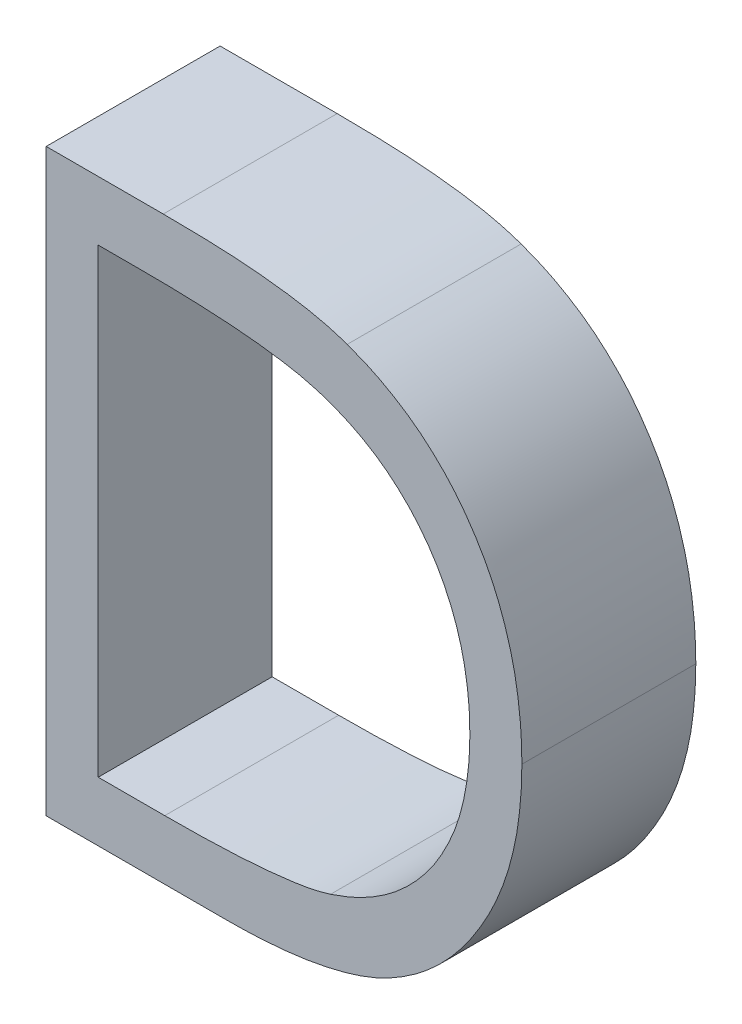
ISO-10303-21;
HEADER;
FILE_DESCRIPTION(('STEP AP214'),'2;1');
FILE_NAME('part.step','',(''),(''),'','','');
FILE_SCHEMA(('AUTOMOTIVE_DESIGN { 1 0 10303 214 1 1 1 1 }'));
ENDSEC;
DATA;
#1=APPLICATION_CONTEXT('core data for automotive mechanical design processes');
#2=APPLICATION_PROTOCOL_DEFINITION('international standard','automotive_design',2000,#1);
#3=PRODUCT_CONTEXT('',#1,'mechanical');
#4=PRODUCT('Part','Part','',(#3));
#5=PRODUCT_RELATED_PRODUCT_CATEGORY('part','',(#4));
#6=PRODUCT_DEFINITION_FORMATION('','',#4);
#7=PRODUCT_DEFINITION_CONTEXT('part definition',#1,'design');
#8=PRODUCT_DEFINITION('design','',#6,#7);
#9=PRODUCT_DEFINITION_SHAPE('','',#8);
#10=(LENGTH_UNIT() NAMED_UNIT(*) SI_UNIT(.MILLI.,.METRE.));
#11=(NAMED_UNIT(*) PLANE_ANGLE_UNIT() SI_UNIT($,.RADIAN.));
#12=(NAMED_UNIT(*) SI_UNIT($,.STERADIAN.) SOLID_ANGLE_UNIT());
#13=UNCERTAINTY_MEASURE_WITH_UNIT(LENGTH_MEASURE(1.E-05),#10,'distance_accuracy_value','');
#14=(GEOMETRIC_REPRESENTATION_CONTEXT(3) GLOBAL_UNCERTAINTY_ASSIGNED_CONTEXT((#13)) GLOBAL_UNIT_ASSIGNED_CONTEXT((#10,
#11,#12)) REPRESENTATION_CONTEXT('',''));
#15=CARTESIAN_POINT('',(0.,0.,0.));
#16=DIRECTION('',(0.,0.,1.));
#17=DIRECTION('',(1.,0.,0.));
#18=AXIS2_PLACEMENT_3D('',#15,#16,#17);
#19=CARTESIAN_POINT('',(-53.6219114175498,-17.9007046131674,1.5));
#20=DIRECTION('',(0.,0.,1.));
#21=DIRECTION('',(1.,0.,0.));
#22=AXIS2_PLACEMENT_3D('',#19,#20,#21);
#23=PLANE('',#22);
#24=DIRECTION('',(-1.,0.,0.));
#25=VECTOR('',#24,1.);
#26=CARTESIAN_POINT('',(-53.8829861592029,-22.8701190762308,1.5));
#27=LINE('',#26,#25);
#28=CARTESIAN_POINT('',(-53.8829861592029,-22.8701190762308,1.5));
#29=VERTEX_POINT('',#28);
#30=CARTESIAN_POINT('',(-55.4324653258695,-22.8701190762308,1.5));
#31=VERTEX_POINT('',#30);
#32=EDGE_CURVE('E235',#29,#31,#27,.T.);
#33=ORIENTED_EDGE('',*,*,#32,.F.);
#34=CARTESIAN_POINT('',(-51.3299012233054,-20.4332200377693,1.5));
#35=CARTESIAN_POINT('',(-51.3307997482756,-20.495021807036,1.5));
#36=CARTESIAN_POINT('',(-51.3325703855776,-20.6168086483907,1.5));
#37=CARTESIAN_POINT('',(-51.3484694082481,-20.7962956421164,1.5));
#38=CARTESIAN_POINT('',(-51.3715784368859,-20.9704578868942,1.5));
#39=CARTESIAN_POINT('',(-51.4073558623674,-21.1384660298124,1.5));
#40=CARTESIAN_POINT('',(-51.4507880244206,-21.3017920553632,1.5));
#41=CARTESIAN_POINT('',(-51.5064510976966,-21.4586952615704,1.5));
#42=CARTESIAN_POINT('',(-51.5702160922337,-21.6106149891884,1.5));
#43=CARTESIAN_POINT('',(-51.6445730616016,-21.7554970976291,1.5));
#44=CARTESIAN_POINT('',(-51.7262036116114,-21.8927590581096,1.5));
#45=CARTESIAN_POINT('',(-51.8138061018961,-22.0221526697083,1.5));
#46=CARTESIAN_POINT('',(-51.9072870953187,-22.1418315580101,1.5));
#47=CARTESIAN_POINT('',(-52.0075379994746,-22.2521581466346,1.5));
#48=CARTESIAN_POINT('',(-52.1132633086879,-22.3529661157688,1.5));
#49=CARTESIAN_POINT('',(-52.2251552094985,-22.4450975662647,1.5));
#50=CARTESIAN_POINT('',(-52.3435024248897,-22.5267497874762,1.5));
#51=CARTESIAN_POINT('',(-52.4677748859757,-22.6011313706446,1.5));
#52=CARTESIAN_POINT('',(-52.6015979276881,-22.6660175928135,1.5));
#53=CARTESIAN_POINT('',(-52.7475063079624,-22.7209176068187,1.5));
#54=CARTESIAN_POINT('',(-52.9061222765083,-22.7664127716345,1.5));
#55=CARTESIAN_POINT('',(-53.0770565006809,-22.8043711942002,1.5));
#56=CARTESIAN_POINT('',(-53.2606043260242,-22.8344816265501,1.5));
#57=CARTESIAN_POINT('',(-53.4569457057732,-22.8546621871754,1.5));
#58=CARTESIAN_POINT('',(-53.665778976758,-22.8683092338802,1.5));
#59=CARTESIAN_POINT('',(-53.809177927102,-22.8695040815388,1.5));
#60=CARTESIAN_POINT('',(-53.8829861592029,-22.8701190762308,1.5));
#61=B_SPLINE_CURVE_WITH_KNOTS('',3,(#34,#35,#36,#37,#38,#39,#40,#41,#42,#43,#44,#45,#46,#47,#48,
#49,#50,#51,#52,#53,#54,#55,#56,#57,#58,#59,#60),.UNSPECIFIED.,.F.,.F.,(4,1,1,1,1,1,1,1,1,1,1,1,
1,1,1,1,1,1,1,1,1,1,1,1,4),(0.,0.0460806833872479,0.0908067996076165,0.13429527052907,
0.177024385666244,0.218822733682656,0.260244116327373,0.301079867113445,0.341613894285157,
0.381583418551746,0.420119591329617,0.458074618542314,0.494738487607657,0.531194622893713,
0.566933698450378,0.602712650737994,0.638326606128435,0.674853248854824,0.71346737078406,
0.75444180384838,0.797815360712499,0.84398945620811,0.893071569879647,0.944963346178144,1.),.UNSPECIFIED.);
#62=CARTESIAN_POINT('',(-51.3299012233054,-20.4332200377693,1.5));
#63=VERTEX_POINT('',#62);
#64=EDGE_CURVE('E193',#63,#29,#61,.T.);
#65=ORIENTED_EDGE('',*,*,#64,.F.);
#66=CARTESIAN_POINT('',(-52.8363114797157,-18.0504075377693,1.5));
#67=CARTESIAN_POINT('',(-52.7784618521337,-18.0724514029748,1.5));
#68=CARTESIAN_POINT('',(-52.6640744345853,-18.1160392516618,1.5));
#69=CARTESIAN_POINT('',(-52.5012071166319,-18.1982625392808,1.5));
#70=CARTESIAN_POINT('',(-52.3478851695367,-18.2914241132085,1.5));
#71=CARTESIAN_POINT('',(-52.2032863911467,-18.3956467741982,1.5));
#72=CARTESIAN_POINT('',(-52.0707137819994,-18.5138815577426,1.5));
#73=CARTESIAN_POINT('',(-51.9449882152343,-18.6411059657797,1.5));
#74=CARTESIAN_POINT('',(-51.8312528955156,-18.7819464518004,1.5));
#75=CARTESIAN_POINT('',(-51.7270981869011,-18.9334821489211,1.5));
#76=CARTESIAN_POINT('',(-51.633190101968,-19.0939279378041,1.5));
#77=CARTESIAN_POINT('',(-51.5515627335972,-19.2629780930813,1.5));
#78=CARTESIAN_POINT('',(-51.4837713145455,-19.4397741045958,1.5));
#79=CARTESIAN_POINT('',(-51.4274952765506,-19.6238243160115,1.5));
#80=CARTESIAN_POINT('',(-51.3831431943504,-19.8155334271712,1.5));
#81=CARTESIAN_POINT('',(-51.3528832919212,-20.0151246644004,1.5));
#82=CARTESIAN_POINT('',(-51.3329247349639,-20.221809220677,1.5));
#83=CARTESIAN_POINT('',(-51.3309189473716,-20.3620584545794,1.5));
#84=CARTESIAN_POINT('',(-51.3299012233054,-20.4332200377693,1.5));
#85=B_SPLINE_CURVE_WITH_KNOTS('',3,(#66,#67,#68,#69,#70,#71,#72,#73,#74,#75,#76,#77,#78,#79,#80,
#81,#82,#83,#84),.UNSPECIFIED.,.F.,.F.,(4,1,1,1,1,1,1,1,1,1,1,1,1,1,1,1,4),(0.,
0.0615449660163235,0.121694296402031,0.181154855452633,0.239875388911957,0.29870194245043,
0.357647423709201,0.417604842849367,0.478494040728292,0.540407050637133,0.602344993872803,
0.665004327923234,0.728559308823376,0.793650542026886,0.860534267590268,0.929235960561963,1.),.UNSPECIFIED.);
#86=CARTESIAN_POINT('',(-52.8363114797157,-18.0504075377693,1.5));
#87=VERTEX_POINT('',#86);
#88=EDGE_CURVE('E199',#87,#63,#85,.T.);
#89=ORIENTED_EDGE('',*,*,#88,.F.);
#90=CARTESIAN_POINT('',(-54.4228499412542,-17.8701190762308,1.5));
#91=CARTESIAN_POINT('',(-54.3350371009594,-17.8707513190822,1.5));
#92=CARTESIAN_POINT('',(-54.165383150508,-17.8719728089807,1.5));
#93=CARTESIAN_POINT('',(-53.9202225112973,-17.879717653468,1.5));
#94=CARTESIAN_POINT('',(-53.6933885649116,-17.8934183189653,1.5));
#95=CARTESIAN_POINT('',(-53.4856273376515,-17.9133747848719,1.5));
#96=CARTESIAN_POINT('',(-53.2963684633837,-17.9378791186167,1.5));
#97=CARTESIAN_POINT('',(-53.1261418803635,-17.9685939819658,1.5));
#98=CARTESIAN_POINT('',(-52.9740673905047,-18.0048627968011,1.5));
#99=CARTESIAN_POINT('',(-52.8805396182344,-18.03578486858,1.5));
#100=CARTESIAN_POINT('',(-52.8363114797157,-18.0504075377693,1.5));
#101=B_SPLINE_CURVE_WITH_KNOTS('',3,(#90,#91,#92,#93,#94,#95,#96,#97,#98,#99,#100),
.UNSPECIFIED.,.F.,.F.,(4,1,1,1,1,1,1,1,4),(0.,0.164289216474763,0.317405911230493,
0.45884361164102,0.589366542305309,0.707831318778175,0.815770030699007,0.912879902902129,1.),.UNSPECIFIED.);
#102=CARTESIAN_POINT('',(-54.4228499412542,-17.8701190762308,1.5));
#103=VERTEX_POINT('',#102);
#104=EDGE_CURVE('E268',#103,#87,#101,.T.);
#105=ORIENTED_EDGE('',*,*,#104,.F.);
#106=DIRECTION('',(1.,0.,0.));
#107=VECTOR('',#106,1.);
#108=CARTESIAN_POINT('',(-55.4324653258695,-17.8701190762308,1.5));
#109=LINE('',#108,#107);
#110=CARTESIAN_POINT('',(-55.4324653258695,-17.8701190762308,1.5));
#111=VERTEX_POINT('',#110);
#112=EDGE_CURVE('E263',#111,#103,#109,.T.);
#113=ORIENTED_EDGE('',*,*,#112,.F.);
#114=DIRECTION('',(0.,1.,0.));
#115=VECTOR('',#114,1.);
#116=CARTESIAN_POINT('',(-55.4324653258695,-22.8701190762308,1.5));
#117=LINE('',#116,#115);
#118=EDGE_CURVE('E261',#31,#111,#117,.T.);
#119=ORIENTED_EDGE('',*,*,#118,.F.);
#120=EDGE_LOOP('',(#33,#65,#89,#105,#113,#119));
#121=FACE_BOUND('',#120,.T.);
#122=DIRECTION('',(1.,0.,0.));
#123=VECTOR('',#122,1.);
#124=CARTESIAN_POINT('',(-54.9837473771516,-22.3572985634103,1.5));
#125=LINE('',#124,#123);
#126=CARTESIAN_POINT('',(-54.9837473771516,-22.3572985634103,1.5));
#127=VERTEX_POINT('',#126);
#128=CARTESIAN_POINT('',(-54.4098291079208,-22.3572985634103,1.5));
#129=VERTEX_POINT('',#128);
#130=EDGE_CURVE('E137',#127,#129,#125,.T.);
#131=ORIENTED_EDGE('',*,*,#130,.F.);
#132=DIRECTION('',(0.,-1.,0.));
#133=VECTOR('',#132,1.);
#134=CARTESIAN_POINT('',(-54.9837473771516,-18.3829395890513,1.5));
#135=LINE('',#134,#133);
#136=CARTESIAN_POINT('',(-54.9837473771516,-18.3829395890513,1.5));
#137=VERTEX_POINT('',#136);
#138=EDGE_CURVE('E129',#137,#127,#135,.T.);
#139=ORIENTED_EDGE('',*,*,#138,.F.);
#140=DIRECTION('',(-1.,0.,0.));
#141=VECTOR('',#140,1.);
#142=CARTESIAN_POINT('',(-54.6321848771516,-18.3829395890513,1.5));
#143=LINE('',#142,#141);
#144=CARTESIAN_POINT('',(-54.6321848771516,-18.3829395890513,1.5));
#145=VERTEX_POINT('',#144);
#146=EDGE_CURVE('E409',#145,#137,#143,.T.);
#147=ORIENTED_EDGE('',*,*,#146,.F.);
#148=CARTESIAN_POINT('',(-53.0957265438183,-18.5231639480257,1.5));
#149=CARTESIAN_POINT('',(-53.1376567529206,-18.5115690510667,1.5));
#150=CARTESIAN_POINT('',(-53.2268118818941,-18.4869151188315,1.5));
#151=CARTESIAN_POINT('',(-53.372296830502,-18.4600217295149,1.5));
#152=CARTESIAN_POINT('',(-53.5360327582583,-18.4363010166337,1.5));
#153=CARTESIAN_POINT('',(-53.7187466169921,-18.4162181032805,1.5));
#154=CARTESIAN_POINT('',(-53.9202301299859,-18.4018076442205,1.5));
#155=CARTESIAN_POINT('',(-54.1406382556794,-18.3909914804957,1.5));
#156=CARTESIAN_POINT('',(-54.3800662622046,-18.3836962912352,1.5));
#157=CARTESIAN_POINT('',(-54.5460413105661,-18.3831981380878,1.5));
#158=CARTESIAN_POINT('',(-54.6321848771516,-18.3829395890513,1.5));
#159=B_SPLINE_CURVE_WITH_KNOTS('',3,(#148,#149,#150,#151,#152,#153,#154,#155,#156,#157,#158),
.UNSPECIFIED.,.F.,.F.,(4,1,1,1,1,1,1,1,4),(0.,0.0843186169585803,0.179284514213904,
0.286582527646563,0.405111483434281,0.535592873418972,0.678190209993415,0.832975839760489,1.),.UNSPECIFIED.);
#160=CARTESIAN_POINT('',(-53.0957265438183,-18.5231639480257,1.5));
#161=VERTEX_POINT('',#160);
#162=EDGE_CURVE('E404',#161,#145,#159,.T.);
#163=ORIENTED_EDGE('',*,*,#162,.F.);
#164=CARTESIAN_POINT('',(-51.7786191720234,-20.4322184352052,1.5));
#165=CARTESIAN_POINT('',(-51.7793524396862,-20.3737420347801,1.5));
#166=CARTESIAN_POINT('',(-51.7807929505004,-20.2588646285409,1.5));
#167=CARTESIAN_POINT('',(-51.7988991082468,-20.090306492437,1.5));
#168=CARTESIAN_POINT('',(-51.8253584732459,-19.928191277401,1.5));
#169=CARTESIAN_POINT('',(-51.8636208818727,-19.7725081411244,1.5));
#170=CARTESIAN_POINT('',(-51.9123792802233,-19.6229533523026,1.5));
#171=CARTESIAN_POINT('',(-51.9732287684464,-19.4803540520222,1.5));
#172=CARTESIAN_POINT('',(-52.0427525102582,-19.3432042393467,1.5));
#173=CARTESIAN_POINT('',(-52.1254715628925,-19.2146694311556,1.5));
#174=CARTESIAN_POINT('',(-52.2160652676935,-19.093107846685,1.5));
#175=CARTESIAN_POINT('',(-52.3166050953138,-18.981743681565,1.5));
#176=CARTESIAN_POINT('',(-52.4254937217833,-18.8803232525971,1.5));
#177=CARTESIAN_POINT('',(-52.5415435067184,-18.7872670916532,1.5));
#178=CARTESIAN_POINT('',(-52.6680250770722,-18.7063189832408,1.5));
#179=CARTESIAN_POINT('',(-52.8019589210582,-18.6339094388377,1.5));
#180=CARTESIAN_POINT('',(-52.9453098798922,-18.5724581654966,1.5));
#181=CARTESIAN_POINT('',(-53.045042302521,-18.5397740758376,1.5));
#182=CARTESIAN_POINT('',(-53.0957265438183,-18.5231639480257,1.5));
#183=B_SPLINE_CURVE_WITH_KNOTS('',3,(#164,#165,#166,#167,#168,#169,#170,#171,#172,#173,#174,
#175,#176,#177,#178,#179,#180,#181,#182),.UNSPECIFIED.,.F.,.F.,(4,1,1,1,1,1,1,1,1,1,1,1,1,1,1,1,
4),(0.,0.0701511759972781,0.137812606190192,0.203226247181393,0.267174055294474,
0.330024003408179,0.391794271786685,0.45308439899714,0.514333907645877,0.574999992818269,
0.634865482622212,0.694116315189641,0.753441621780439,0.813125800303611,0.874079685637075,
0.936007013274407,1.),.UNSPECIFIED.);
#184=CARTESIAN_POINT('',(-51.7786191720234,-20.4322184352052,1.5));
#185=VERTEX_POINT('',#184);
#186=EDGE_CURVE('E410',#185,#161,#183,.T.);
#187=ORIENTED_EDGE('',*,*,#186,.F.);
#188=CARTESIAN_POINT('',(-52.9805422489465,-22.2300950377693,1.5));
#189=CARTESIAN_POINT('',(-52.9349017316935,-22.2140213831368,1.5));
#190=CARTESIAN_POINT('',(-52.8447108200021,-22.1822579927817,1.5));
#191=CARTESIAN_POINT('',(-52.7148806982816,-22.1243184767995,1.5));
#192=CARTESIAN_POINT('',(-52.5937992630563,-22.0556869485859,1.5));
#193=CARTESIAN_POINT('',(-52.4793563697904,-21.9793979857528,1.5));
#194=CARTESIAN_POINT('',(-52.3731754334603,-21.8927608400144,1.5));
#195=CARTESIAN_POINT('',(-52.2739981244498,-21.7976594274373,1.5));
#196=CARTESIAN_POINT('',(-52.1820241225068,-21.6936097487633,1.5));
#197=CARTESIAN_POINT('',(-52.0982036825198,-21.5807409465306,1.5));
#198=CARTESIAN_POINT('',(-52.0231918196151,-21.4597555241872,1.5));
#199=CARTESIAN_POINT('',(-51.9582329204596,-21.3318429046556,1.5));
#200=CARTESIAN_POINT('',(-51.9013021610433,-21.1984046043415,1.5));
#201=CARTESIAN_POINT('',(-51.8566184573059,-21.0573915205505,1.5));
#202=CARTESIAN_POINT('',(-51.8215961942011,-20.910064294242,1.5));
#203=CARTESIAN_POINT('',(-51.7967894971156,-20.7564125610111,1.5));
#204=CARTESIAN_POINT('',(-51.7813398907445,-20.5964650155018,1.5));
#205=CARTESIAN_POINT('',(-51.7795378222607,-20.4876762665487,1.5));
#206=CARTESIAN_POINT('',(-51.7786191720234,-20.4322184352052,1.5));
#207=B_SPLINE_CURVE_WITH_KNOTS('',3,(#188,#189,#190,#191,#192,#193,#194,#195,#196,#197,#198,
#199,#200,#201,#202,#203,#204,#205,#206),.UNSPECIFIED.,.F.,.F.,(4,1,1,1,1,1,1,1,1,1,1,1,1,1,1,1,
4),(0.,0.0624145002632765,0.123338231473312,0.183124537692192,0.241782994638942,
0.300578882550978,0.359680074896626,0.418881640850047,0.479530664457783,0.540850535760039,
0.602303395898379,0.664463211946473,0.727805722667011,0.792894814781235,0.859672328302831,
0.928464400733489,1.),.UNSPECIFIED.);
#208=CARTESIAN_POINT('',(-52.9805422489465,-22.2300950377693,1.5));
#209=VERTEX_POINT('',#208);
#210=EDGE_CURVE('E152',#209,#185,#207,.T.);
#211=ORIENTED_EDGE('',*,*,#210,.F.);
#212=CARTESIAN_POINT('',(-54.4098291079208,-22.3572985634103,1.5));
#213=CARTESIAN_POINT('',(-54.3273600068637,-22.3569441400188,1.5));
#214=CARTESIAN_POINT('',(-54.1687417234168,-22.3562624540387,1.5));
#215=CARTESIAN_POINT('',(-53.9406588701467,-22.3502807352769,1.5));
#216=CARTESIAN_POINT('',(-53.7322597323313,-22.3405065388436,1.5));
#217=CARTESIAN_POINT('',(-53.5435147189124,-22.3268278562598,1.5));
#218=CARTESIAN_POINT('',(-53.3745303984877,-22.3087298345622,1.5));
#219=CARTESIAN_POINT('',(-53.2249536129411,-22.2885514020658,1.5));
#220=CARTESIAN_POINT('',(-53.095274672477,-22.2634121867,1.5));
#221=CARTESIAN_POINT('',(-53.0168040482742,-22.240625101822,1.5));
#222=CARTESIAN_POINT('',(-52.9805422489465,-22.2300950377693,1.5));
#223=B_SPLINE_CURVE_WITH_KNOTS('',3,(#212,#213,#214,#215,#216,#217,#218,#219,#220,#221,#222),
.UNSPECIFIED.,.F.,.F.,(4,1,1,1,1,1,1,1,4),(0.,0.171900664613267,0.330627932095882,
0.475548835880918,0.606746190312361,0.725023803467487,0.829742386958453,0.921322820343976,1.),.UNSPECIFIED.);
#224=EDGE_CURVE('E150',#129,#209,#223,.T.);
#225=ORIENTED_EDGE('',*,*,#224,.F.);
#226=EDGE_LOOP('',(#131,#139,#147,#163,#187,#211,#225));
#227=FACE_BOUND('',#226,.T.);
#228=ADVANCED_FACE('F33',(#121,#227),#23,.T.);
#229=CARTESIAN_POINT('',(-53.6219114175498,-17.9007046131674,0.));
#230=DIRECTION('',(0.,0.,1.));
#231=DIRECTION('',(1.,0.,0.));
#232=AXIS2_PLACEMENT_3D('',#229,#230,#231);
#233=PLANE('',#232);
#234=DIRECTION('',(-1.,0.,0.));
#235=VECTOR('',#234,1.);
#236=CARTESIAN_POINT('',(-53.8829861592029,-22.8701190762308,0.));
#237=LINE('',#236,#235);
#238=CARTESIAN_POINT('',(-53.8829861592029,-22.8701190762308,0.));
#239=VERTEX_POINT('',#238);
#240=CARTESIAN_POINT('',(-55.4324653258695,-22.8701190762308,0.));
#241=VERTEX_POINT('',#240);
#242=EDGE_CURVE('E145',#239,#241,#237,.T.);
#243=ORIENTED_EDGE('',*,*,#242,.T.);
#244=DIRECTION('',(0.,1.,0.));
#245=VECTOR('',#244,1.);
#246=CARTESIAN_POINT('',(-55.4324653258695,-22.8701190762308,0.));
#247=LINE('',#246,#245);
#248=CARTESIAN_POINT('',(-55.4324653258695,-17.8701190762308,0.));
#249=VERTEX_POINT('',#248);
#250=EDGE_CURVE('E209',#241,#249,#247,.T.);
#251=ORIENTED_EDGE('',*,*,#250,.T.);
#252=DIRECTION('',(1.,0.,0.));
#253=VECTOR('',#252,1.);
#254=CARTESIAN_POINT('',(-55.4324653258695,-17.8701190762308,0.));
#255=LINE('',#254,#253);
#256=CARTESIAN_POINT('',(-54.4228499412542,-17.8701190762308,0.));
#257=VERTEX_POINT('',#256);
#258=EDGE_CURVE('E212',#249,#257,#255,.T.);
#259=ORIENTED_EDGE('',*,*,#258,.T.);
#260=CARTESIAN_POINT('',(-54.4228499412542,-17.8701190762308,0.));
#261=CARTESIAN_POINT('',(-54.3350371009594,-17.8707513190822,0.));
#262=CARTESIAN_POINT('',(-54.165383150508,-17.8719728089807,0.));
#263=CARTESIAN_POINT('',(-53.9202225112973,-17.879717653468,0.));
#264=CARTESIAN_POINT('',(-53.6933885649116,-17.8934183189653,0.));
#265=CARTESIAN_POINT('',(-53.4856273376515,-17.9133747848719,0.));
#266=CARTESIAN_POINT('',(-53.2963684633837,-17.9378791186167,0.));
#267=CARTESIAN_POINT('',(-53.1261418803635,-17.9685939819658,0.));
#268=CARTESIAN_POINT('',(-52.9740673905047,-18.0048627968011,0.));
#269=CARTESIAN_POINT('',(-52.8805396182344,-18.03578486858,0.));
#270=CARTESIAN_POINT('',(-52.8363114797157,-18.0504075377693,0.));
#271=B_SPLINE_CURVE_WITH_KNOTS('',3,(#260,#261,#262,#263,#264,#265,#266,#267,#268,#269,#270),
.UNSPECIFIED.,.F.,.F.,(4,1,1,1,1,1,1,1,4),(0.,0.164289216474763,0.317405911230493,
0.45884361164102,0.589366542305309,0.707831318778175,0.815770030699007,0.912879902902129,1.),.UNSPECIFIED.);
#272=CARTESIAN_POINT('',(-52.8363114797157,-18.0504075377693,0.));
#273=VERTEX_POINT('',#272);
#274=EDGE_CURVE('E215',#257,#273,#271,.T.);
#275=ORIENTED_EDGE('',*,*,#274,.T.);
#276=CARTESIAN_POINT('',(-52.8363114797157,-18.0504075377693,0.));
#277=CARTESIAN_POINT('',(-52.7784618521337,-18.0724514029748,0.));
#278=CARTESIAN_POINT('',(-52.6640744345853,-18.1160392516618,0.));
#279=CARTESIAN_POINT('',(-52.5012071166319,-18.1982625392808,0.));
#280=CARTESIAN_POINT('',(-52.3478851695367,-18.2914241132085,0.));
#281=CARTESIAN_POINT('',(-52.2032863911467,-18.3956467741982,0.));
#282=CARTESIAN_POINT('',(-52.0707137819994,-18.5138815577426,0.));
#283=CARTESIAN_POINT('',(-51.9449882152343,-18.6411059657797,0.));
#284=CARTESIAN_POINT('',(-51.8312528955156,-18.7819464518004,0.));
#285=CARTESIAN_POINT('',(-51.7270981869011,-18.9334821489211,0.));
#286=CARTESIAN_POINT('',(-51.633190101968,-19.0939279378041,0.));
#287=CARTESIAN_POINT('',(-51.5515627335972,-19.2629780930813,0.));
#288=CARTESIAN_POINT('',(-51.4837713145455,-19.4397741045958,0.));
#289=CARTESIAN_POINT('',(-51.4274952765506,-19.6238243160115,0.));
#290=CARTESIAN_POINT('',(-51.3831431943504,-19.8155334271712,0.));
#291=CARTESIAN_POINT('',(-51.3528832919212,-20.0151246644004,0.));
#292=CARTESIAN_POINT('',(-51.3329247349639,-20.221809220677,0.));
#293=CARTESIAN_POINT('',(-51.3309189473716,-20.3620584545794,0.));
#294=CARTESIAN_POINT('',(-51.3299012233054,-20.4332200377693,0.));
#295=B_SPLINE_CURVE_WITH_KNOTS('',3,(#276,#277,#278,#279,#280,#281,#282,#283,#284,#285,#286,
#287,#288,#289,#290,#291,#292,#293,#294),.UNSPECIFIED.,.F.,.F.,(4,1,1,1,1,1,1,1,1,1,1,1,1,1,1,1,
4),(0.,0.0615449660163235,0.121694296402031,0.181154855452633,0.239875388911957,
0.29870194245043,0.357647423709201,0.417604842849367,0.478494040728292,0.540407050637133,
0.602344993872803,0.665004327923234,0.728559308823376,0.793650542026886,0.860534267590268,
0.929235960561963,1.),.UNSPECIFIED.);
#296=CARTESIAN_POINT('',(-51.3299012233054,-20.4332200377693,0.));
#297=VERTEX_POINT('',#296);
#298=EDGE_CURVE('E220',#273,#297,#295,.T.);
#299=ORIENTED_EDGE('',*,*,#298,.T.);
#300=CARTESIAN_POINT('',(-51.3299012233054,-20.4332200377693,0.));
#301=CARTESIAN_POINT('',(-51.3307997482756,-20.495021807036,0.));
#302=CARTESIAN_POINT('',(-51.3325703855776,-20.6168086483907,0.));
#303=CARTESIAN_POINT('',(-51.3484694082481,-20.7962956421164,0.));
#304=CARTESIAN_POINT('',(-51.3715784368859,-20.9704578868942,0.));
#305=CARTESIAN_POINT('',(-51.4073558623674,-21.1384660298124,0.));
#306=CARTESIAN_POINT('',(-51.4507880244206,-21.3017920553632,0.));
#307=CARTESIAN_POINT('',(-51.5064510976966,-21.4586952615704,0.));
#308=CARTESIAN_POINT('',(-51.5702160922337,-21.6106149891884,0.));
#309=CARTESIAN_POINT('',(-51.6445730616016,-21.7554970976291,0.));
#310=CARTESIAN_POINT('',(-51.7262036116114,-21.8927590581096,0.));
#311=CARTESIAN_POINT('',(-51.8138061018961,-22.0221526697083,0.));
#312=CARTESIAN_POINT('',(-51.9072870953187,-22.1418315580101,0.));
#313=CARTESIAN_POINT('',(-52.0075379994746,-22.2521581466346,0.));
#314=CARTESIAN_POINT('',(-52.1132633086879,-22.3529661157688,0.));
#315=CARTESIAN_POINT('',(-52.2251552094985,-22.4450975662647,0.));
#316=CARTESIAN_POINT('',(-52.3435024248897,-22.5267497874762,0.));
#317=CARTESIAN_POINT('',(-52.4677748859757,-22.6011313706446,0.));
#318=CARTESIAN_POINT('',(-52.6015979276881,-22.6660175928135,0.));
#319=CARTESIAN_POINT('',(-52.7475063079624,-22.7209176068187,0.));
#320=CARTESIAN_POINT('',(-52.9061222765083,-22.7664127716345,0.));
#321=CARTESIAN_POINT('',(-53.0770565006809,-22.8043711942002,0.));
#322=CARTESIAN_POINT('',(-53.2606043260242,-22.8344816265501,0.));
#323=CARTESIAN_POINT('',(-53.4569457057732,-22.8546621871754,0.));
#324=CARTESIAN_POINT('',(-53.665778976758,-22.8683092338802,0.));
#325=CARTESIAN_POINT('',(-53.809177927102,-22.8695040815388,0.));
#326=CARTESIAN_POINT('',(-53.8829861592029,-22.8701190762308,0.));
#327=B_SPLINE_CURVE_WITH_KNOTS('',3,(#300,#301,#302,#303,#304,#305,#306,#307,#308,#309,#310,
#311,#312,#313,#314,#315,#316,#317,#318,#319,#320,#321,#322,#323,#324,#325,#326),.UNSPECIFIED.,
.F.,.F.,(4,1,1,1,1,1,1,1,1,1,1,1,1,1,1,1,1,1,1,1,1,1,1,1,4),(0.,0.0460806833872479,
0.0908067996076165,0.13429527052907,0.177024385666244,0.218822733682656,0.260244116327373,
0.301079867113445,0.341613894285157,0.381583418551746,0.420119591329617,0.458074618542314,
0.494738487607657,0.531194622893713,0.566933698450378,0.602712650737994,0.638326606128435,
0.674853248854824,0.71346737078406,0.75444180384838,0.797815360712499,0.84398945620811,
0.893071569879647,0.944963346178144,1.),.UNSPECIFIED.);
#328=EDGE_CURVE('E228',#297,#239,#327,.T.);
#329=ORIENTED_EDGE('',*,*,#328,.T.);
#330=EDGE_LOOP('',(#243,#251,#259,#275,#299,#329));
#331=FACE_BOUND('',#330,.T.);
#332=DIRECTION('',(0.,-1.,0.));
#333=VECTOR('',#332,1.);
#334=CARTESIAN_POINT('',(-54.9837473771516,-18.3829395890513,0.));
#335=LINE('',#334,#333);
#336=CARTESIAN_POINT('',(-54.9837473771516,-18.3829395890513,0.));
#337=VERTEX_POINT('',#336);
#338=CARTESIAN_POINT('',(-54.9837473771516,-22.3572985634103,0.));
#339=VERTEX_POINT('',#338);
#340=EDGE_CURVE('E58',#337,#339,#335,.T.);
#341=ORIENTED_EDGE('',*,*,#340,.T.);
#342=DIRECTION('',(1.,0.,0.));
#343=VECTOR('',#342,1.);
#344=CARTESIAN_POINT('',(-54.9837473771516,-22.3572985634103,0.));
#345=LINE('',#344,#343);
#346=CARTESIAN_POINT('',(-54.4098291079208,-22.3572985634103,0.));
#347=VERTEX_POINT('',#346);
#348=EDGE_CURVE('E144',#339,#347,#345,.T.);
#349=ORIENTED_EDGE('',*,*,#348,.T.);
#350=CARTESIAN_POINT('',(-54.4098291079208,-22.3572985634103,0.));
#351=CARTESIAN_POINT('',(-54.3273600068637,-22.3569441400188,0.));
#352=CARTESIAN_POINT('',(-54.1687417234168,-22.3562624540387,0.));
#353=CARTESIAN_POINT('',(-53.9406588701467,-22.3502807352769,0.));
#354=CARTESIAN_POINT('',(-53.7322597323313,-22.3405065388436,0.));
#355=CARTESIAN_POINT('',(-53.5435147189124,-22.3268278562598,0.));
#356=CARTESIAN_POINT('',(-53.3745303984877,-22.3087298345622,0.));
#357=CARTESIAN_POINT('',(-53.2249536129411,-22.2885514020658,0.));
#358=CARTESIAN_POINT('',(-53.095274672477,-22.2634121867,0.));
#359=CARTESIAN_POINT('',(-53.0168040482742,-22.240625101822,0.));
#360=CARTESIAN_POINT('',(-52.9805422489465,-22.2300950377693,0.));
#361=B_SPLINE_CURVE_WITH_KNOTS('',3,(#350,#351,#352,#353,#354,#355,#356,#357,#358,#359,#360),
.UNSPECIFIED.,.F.,.F.,(4,1,1,1,1,1,1,1,4),(0.,0.171900664613267,0.330627932095882,
0.475548835880918,0.606746190312361,0.725023803467487,0.829742386958453,0.921322820343976,1.),.UNSPECIFIED.);
#362=CARTESIAN_POINT('',(-52.9805422489465,-22.2300950377693,0.));
#363=VERTEX_POINT('',#362);
#364=EDGE_CURVE('E420',#347,#363,#361,.T.);
#365=ORIENTED_EDGE('',*,*,#364,.T.);
#366=CARTESIAN_POINT('',(-52.9805422489465,-22.2300950377693,0.));
#367=CARTESIAN_POINT('',(-52.9349017316935,-22.2140213831368,0.));
#368=CARTESIAN_POINT('',(-52.8447108200021,-22.1822579927817,0.));
#369=CARTESIAN_POINT('',(-52.7148806982816,-22.1243184767995,0.));
#370=CARTESIAN_POINT('',(-52.5937992630563,-22.0556869485859,0.));
#371=CARTESIAN_POINT('',(-52.4793563697904,-21.9793979857528,0.));
#372=CARTESIAN_POINT('',(-52.3731754334603,-21.8927608400144,0.));
#373=CARTESIAN_POINT('',(-52.2739981244498,-21.7976594274373,0.));
#374=CARTESIAN_POINT('',(-52.1820241225068,-21.6936097487633,0.));
#375=CARTESIAN_POINT('',(-52.0982036825198,-21.5807409465306,0.));
#376=CARTESIAN_POINT('',(-52.0231918196151,-21.4597555241872,0.));
#377=CARTESIAN_POINT('',(-51.9582329204596,-21.3318429046556,0.));
#378=CARTESIAN_POINT('',(-51.9013021610433,-21.1984046043415,0.));
#379=CARTESIAN_POINT('',(-51.8566184573059,-21.0573915205505,0.));
#380=CARTESIAN_POINT('',(-51.8215961942011,-20.910064294242,0.));
#381=CARTESIAN_POINT('',(-51.7967894971156,-20.7564125610111,0.));
#382=CARTESIAN_POINT('',(-51.7813398907445,-20.5964650155018,0.));
#383=CARTESIAN_POINT('',(-51.7795378222607,-20.4876762665487,0.));
#384=CARTESIAN_POINT('',(-51.7786191720234,-20.4322184352052,0.));
#385=B_SPLINE_CURVE_WITH_KNOTS('',3,(#366,#367,#368,#369,#370,#371,#372,#373,#374,#375,#376,
#377,#378,#379,#380,#381,#382,#383,#384),.UNSPECIFIED.,.F.,.F.,(4,1,1,1,1,1,1,1,1,1,1,1,1,1,1,1,
4),(0.,0.0624145002632765,0.123338231473312,0.183124537692192,0.241782994638942,
0.300578882550978,0.359680074896626,0.418881640850047,0.479530664457783,0.540850535760039,
0.602303395898379,0.664463211946473,0.727805722667011,0.792894814781235,0.859672328302831,
0.928464400733489,1.),.UNSPECIFIED.);
#386=CARTESIAN_POINT('',(-51.7786191720234,-20.4322184352052,0.));
#387=VERTEX_POINT('',#386);
#388=EDGE_CURVE('E425',#363,#387,#385,.T.);
#389=ORIENTED_EDGE('',*,*,#388,.T.);
#390=CARTESIAN_POINT('',(-51.7786191720234,-20.4322184352052,0.));
#391=CARTESIAN_POINT('',(-51.7793524396862,-20.3737420347801,0.));
#392=CARTESIAN_POINT('',(-51.7807929505004,-20.2588646285409,0.));
#393=CARTESIAN_POINT('',(-51.7988991082468,-20.090306492437,0.));
#394=CARTESIAN_POINT('',(-51.8253584732459,-19.928191277401,0.));
#395=CARTESIAN_POINT('',(-51.8636208818727,-19.7725081411244,0.));
#396=CARTESIAN_POINT('',(-51.9123792802233,-19.6229533523026,0.));
#397=CARTESIAN_POINT('',(-51.9732287684464,-19.4803540520222,0.));
#398=CARTESIAN_POINT('',(-52.0427525102582,-19.3432042393467,0.));
#399=CARTESIAN_POINT('',(-52.1254715628925,-19.2146694311556,0.));
#400=CARTESIAN_POINT('',(-52.2160652676935,-19.093107846685,0.));
#401=CARTESIAN_POINT('',(-52.3166050953138,-18.981743681565,0.));
#402=CARTESIAN_POINT('',(-52.4254937217833,-18.8803232525971,0.));
#403=CARTESIAN_POINT('',(-52.5415435067184,-18.7872670916532,0.));
#404=CARTESIAN_POINT('',(-52.6680250770722,-18.7063189832408,0.));
#405=CARTESIAN_POINT('',(-52.8019589210582,-18.6339094388377,0.));
#406=CARTESIAN_POINT('',(-52.9453098798922,-18.5724581654966,0.));
#407=CARTESIAN_POINT('',(-53.045042302521,-18.5397740758376,0.));
#408=CARTESIAN_POINT('',(-53.0957265438183,-18.5231639480257,0.));
#409=B_SPLINE_CURVE_WITH_KNOTS('',3,(#390,#391,#392,#393,#394,#395,#396,#397,#398,#399,#400,
#401,#402,#403,#404,#405,#406,#407,#408),.UNSPECIFIED.,.F.,.F.,(4,1,1,1,1,1,1,1,1,1,1,1,1,1,1,1,
4),(0.,0.0701511759972781,0.137812606190192,0.203226247181393,0.267174055294474,
0.330024003408179,0.391794271786685,0.45308439899714,0.514333907645877,0.574999992818269,
0.634865482622212,0.694116315189641,0.753441621780439,0.813125800303611,0.874079685637075,
0.936007013274407,1.),.UNSPECIFIED.);
#410=CARTESIAN_POINT('',(-53.0957265438183,-18.5231639480257,0.));
#411=VERTEX_POINT('',#410);
#412=EDGE_CURVE('E433',#387,#411,#409,.T.);
#413=ORIENTED_EDGE('',*,*,#412,.T.);
#414=CARTESIAN_POINT('',(-53.0957265438183,-18.5231639480257,0.));
#415=CARTESIAN_POINT('',(-53.1376567529206,-18.5115690510667,0.));
#416=CARTESIAN_POINT('',(-53.2268118818941,-18.4869151188315,0.));
#417=CARTESIAN_POINT('',(-53.372296830502,-18.4600217295149,0.));
#418=CARTESIAN_POINT('',(-53.5360327582583,-18.4363010166337,0.));
#419=CARTESIAN_POINT('',(-53.7187466169921,-18.4162181032805,0.));
#420=CARTESIAN_POINT('',(-53.9202301299859,-18.4018076442205,0.));
#421=CARTESIAN_POINT('',(-54.1406382556794,-18.3909914804957,0.));
#422=CARTESIAN_POINT('',(-54.3800662622046,-18.3836962912352,0.));
#423=CARTESIAN_POINT('',(-54.5460413105661,-18.3831981380878,0.));
#424=CARTESIAN_POINT('',(-54.6321848771516,-18.3829395890513,0.));
#425=B_SPLINE_CURVE_WITH_KNOTS('',3,(#414,#415,#416,#417,#418,#419,#420,#421,#422,#423,#424),
.UNSPECIFIED.,.F.,.F.,(4,1,1,1,1,1,1,1,4),(0.,0.0843186169585803,0.179284514213904,
0.286582527646563,0.405111483434281,0.535592873418972,0.678190209993415,0.832975839760489,1.),.UNSPECIFIED.);
#426=CARTESIAN_POINT('',(-54.6321848771516,-18.3829395890513,0.));
#427=VERTEX_POINT('',#426);
#428=EDGE_CURVE('E441',#411,#427,#425,.T.);
#429=ORIENTED_EDGE('',*,*,#428,.T.);
#430=DIRECTION('',(-1.,0.,0.));
#431=VECTOR('',#430,1.);
#432=CARTESIAN_POINT('',(-54.6321848771516,-18.3829395890513,0.));
#433=LINE('',#432,#431);
#434=EDGE_CURVE('E138',#427,#337,#433,.T.);
#435=ORIENTED_EDGE('',*,*,#434,.T.);
#436=EDGE_LOOP('',(#341,#349,#365,#389,#413,#429,#435));
#437=FACE_BOUND('',#436,.T.);
#438=ADVANCED_FACE('F180',(#331,#437),#233,.F.);
#439=CARTESIAN_POINT('',(-53.8829861592029,-22.8701190762308,1.5));
#440=DIRECTION('',(0.,-1.,0.));
#441=DIRECTION('',(0.,0.,-1.));
#442=AXIS2_PLACEMENT_3D('',#439,#440,#441);
#443=PLANE('',#442);
#444=ORIENTED_EDGE('',*,*,#242,.F.);
#445=DIRECTION('',(0.,0.,-1.));
#446=VECTOR('',#445,1.);
#447=CARTESIAN_POINT('',(-53.8829861592029,-22.8701190762308,1.5));
#448=LINE('',#447,#446);
#449=EDGE_CURVE('E11',#29,#239,#448,.T.);
#450=ORIENTED_EDGE('',*,*,#449,.F.);
#451=ORIENTED_EDGE('',*,*,#32,.T.);
#452=DIRECTION('',(0.,0.,-1.));
#453=VECTOR('',#452,1.);
#454=CARTESIAN_POINT('',(-55.4324653258695,-22.8701190762308,1.5));
#455=LINE('',#454,#453);
#456=EDGE_CURVE('E37',#31,#241,#455,.T.);
#457=ORIENTED_EDGE('',*,*,#456,.T.);
#458=EDGE_LOOP('',(#444,#450,#451,#457));
#459=FACE_BOUND('',#458,.T.);
#460=ADVANCED_FACE('F35',(#459),#443,.T.);
#461=DIRECTION('',(0.,0.,-1.));
#462=VECTOR('',#461,1.);
#463=SURFACE_OF_LINEAR_EXTRUSION('',#61,#462);
#464=ORIENTED_EDGE('',*,*,#328,.F.);
#465=DIRECTION('',(0.,0.,-1.));
#466=VECTOR('',#465,1.);
#467=CARTESIAN_POINT('',(-51.3299012233054,-20.4332200377693,1.5));
#468=LINE('',#467,#466);
#469=EDGE_CURVE('E42',#63,#297,#468,.T.);
#470=ORIENTED_EDGE('',*,*,#469,.F.);
#471=ORIENTED_EDGE('',*,*,#64,.T.);
#472=ORIENTED_EDGE('',*,*,#449,.T.);
#473=EDGE_LOOP('',(#464,#470,#471,#472));
#474=FACE_BOUND('',#473,.T.);
#475=ADVANCED_FACE('F185',(#474),#463,.T.);
#476=DIRECTION('',(0.,0.,-1.));
#477=VECTOR('',#476,1.);
#478=SURFACE_OF_LINEAR_EXTRUSION('',#85,#477);
#479=ORIENTED_EDGE('',*,*,#298,.F.);
#480=DIRECTION('',(0.,0.,-1.));
#481=VECTOR('',#480,1.);
#482=CARTESIAN_POINT('',(-52.8363114797157,-18.0504075377693,1.5));
#483=LINE('',#482,#481);
#484=EDGE_CURVE('E241',#87,#273,#483,.T.);
#485=ORIENTED_EDGE('',*,*,#484,.F.);
#486=ORIENTED_EDGE('',*,*,#88,.T.);
#487=ORIENTED_EDGE('',*,*,#469,.T.);
#488=EDGE_LOOP('',(#479,#485,#486,#487));
#489=FACE_BOUND('',#488,.T.);
#490=ADVANCED_FACE('F189',(#489),#478,.T.);
#491=DIRECTION('',(0.,0.,-1.));
#492=VECTOR('',#491,1.);
#493=SURFACE_OF_LINEAR_EXTRUSION('',#101,#492);
#494=ORIENTED_EDGE('',*,*,#274,.F.);
#495=DIRECTION('',(0.,0.,-1.));
#496=VECTOR('',#495,1.);
#497=CARTESIAN_POINT('',(-54.4228499412542,-17.8701190762308,1.5));
#498=LINE('',#497,#496);
#499=EDGE_CURVE('E243',#103,#257,#498,.T.);
#500=ORIENTED_EDGE('',*,*,#499,.F.);
#501=ORIENTED_EDGE('',*,*,#104,.T.);
#502=ORIENTED_EDGE('',*,*,#484,.T.);
#503=EDGE_LOOP('',(#494,#500,#501,#502));
#504=FACE_BOUND('',#503,.T.);
#505=ADVANCED_FACE('F276',(#504),#493,.T.);
#506=CARTESIAN_POINT('',(-55.4324653258695,-17.8701190762308,1.5));
#507=DIRECTION('',(0.,1.,0.));
#508=DIRECTION('',(0.,0.,1.));
#509=AXIS2_PLACEMENT_3D('',#506,#507,#508);
#510=PLANE('',#509);
#511=ORIENTED_EDGE('',*,*,#258,.F.);
#512=DIRECTION('',(0.,0.,-1.));
#513=VECTOR('',#512,1.);
#514=CARTESIAN_POINT('',(-55.4324653258695,-17.8701190762308,1.5));
#515=LINE('',#514,#513);
#516=EDGE_CURVE('E244',#111,#249,#515,.T.);
#517=ORIENTED_EDGE('',*,*,#516,.F.);
#518=ORIENTED_EDGE('',*,*,#112,.T.);
#519=ORIENTED_EDGE('',*,*,#499,.T.);
#520=EDGE_LOOP('',(#511,#517,#518,#519));
#521=FACE_BOUND('',#520,.T.);
#522=ADVANCED_FACE('F279',(#521),#510,.T.);
#523=CARTESIAN_POINT('',(-55.4324653258695,-22.8701190762308,1.5));
#524=DIRECTION('',(-1.,0.,0.));
#525=DIRECTION('',(0.,0.,1.));
#526=AXIS2_PLACEMENT_3D('',#523,#524,#525);
#527=PLANE('',#526);
#528=ORIENTED_EDGE('',*,*,#250,.F.);
#529=ORIENTED_EDGE('',*,*,#456,.F.);
#530=ORIENTED_EDGE('',*,*,#118,.T.);
#531=ORIENTED_EDGE('',*,*,#516,.T.);
#532=EDGE_LOOP('',(#528,#529,#530,#531));
#533=FACE_BOUND('',#532,.T.);
#534=ADVANCED_FACE('F177',(#533),#527,.T.);
#535=CARTESIAN_POINT('',(-54.9837473771516,-18.3829395890513,1.5));
#536=DIRECTION('',(1.,0.,0.));
#537=DIRECTION('',(0.,0.,-1.));
#538=AXIS2_PLACEMENT_3D('',#535,#536,#537);
#539=PLANE('',#538);
#540=ORIENTED_EDGE('',*,*,#340,.F.);
#541=DIRECTION('',(0.,0.,-1.));
#542=VECTOR('',#541,1.);
#543=CARTESIAN_POINT('',(-54.9837473771516,-18.3829395890513,1.5));
#544=LINE('',#543,#542);
#545=EDGE_CURVE('E133',#137,#337,#544,.T.);
#546=ORIENTED_EDGE('',*,*,#545,.F.);
#547=ORIENTED_EDGE('',*,*,#138,.T.);
#548=DIRECTION('',(0.,0.,-1.));
#549=VECTOR('',#548,1.);
#550=CARTESIAN_POINT('',(-54.9837473771516,-22.3572985634103,1.5));
#551=LINE('',#550,#549);
#552=EDGE_CURVE('E132',#127,#339,#551,.T.);
#553=ORIENTED_EDGE('',*,*,#552,.T.);
#554=EDGE_LOOP('',(#540,#546,#547,#553));
#555=FACE_BOUND('',#554,.T.);
#556=ADVANCED_FACE('F131',(#555),#539,.T.);
#557=CARTESIAN_POINT('',(-54.9837473771516,-22.3572985634103,1.5));
#558=DIRECTION('',(0.,1.,0.));
#559=DIRECTION('',(0.,0.,1.));
#560=AXIS2_PLACEMENT_3D('',#557,#558,#559);
#561=PLANE('',#560);
#562=ORIENTED_EDGE('',*,*,#348,.F.);
#563=ORIENTED_EDGE('',*,*,#552,.F.);
#564=ORIENTED_EDGE('',*,*,#130,.T.);
#565=DIRECTION('',(0.,0.,-1.));
#566=VECTOR('',#565,1.);
#567=CARTESIAN_POINT('',(-54.4098291079208,-22.3572985634103,1.5));
#568=LINE('',#567,#566);
#569=EDGE_CURVE('E146',#129,#347,#568,.T.);
#570=ORIENTED_EDGE('',*,*,#569,.T.);
#571=EDGE_LOOP('',(#562,#563,#564,#570));
#572=FACE_BOUND('',#571,.T.);
#573=ADVANCED_FACE('F141',(#572),#561,.T.);
#574=DIRECTION('',(0.,0.,-1.));
#575=VECTOR('',#574,1.);
#576=SURFACE_OF_LINEAR_EXTRUSION('',#223,#575);
#577=ORIENTED_EDGE('',*,*,#364,.F.);
#578=ORIENTED_EDGE('',*,*,#569,.F.);
#579=ORIENTED_EDGE('',*,*,#224,.T.);
#580=DIRECTION('',(0.,0.,-1.));
#581=VECTOR('',#580,1.);
#582=CARTESIAN_POINT('',(-52.9805422489465,-22.2300950377693,1.5));
#583=LINE('',#582,#581);
#584=EDGE_CURVE('E460',#209,#363,#583,.T.);
#585=ORIENTED_EDGE('',*,*,#584,.T.);
#586=EDGE_LOOP('',(#577,#578,#579,#585));
#587=FACE_BOUND('',#586,.T.);
#588=ADVANCED_FACE('F166',(#587),#576,.T.);
#589=DIRECTION('',(0.,0.,-1.));
#590=VECTOR('',#589,1.);
#591=SURFACE_OF_LINEAR_EXTRUSION('',#207,#590);
#592=ORIENTED_EDGE('',*,*,#388,.F.);
#593=ORIENTED_EDGE('',*,*,#584,.F.);
#594=ORIENTED_EDGE('',*,*,#210,.T.);
#595=DIRECTION('',(0.,0.,-1.));
#596=VECTOR('',#595,1.);
#597=CARTESIAN_POINT('',(-51.7786191720234,-20.4322184352052,1.5));
#598=LINE('',#597,#596);
#599=EDGE_CURVE('E458',#185,#387,#598,.T.);
#600=ORIENTED_EDGE('',*,*,#599,.T.);
#601=EDGE_LOOP('',(#592,#593,#594,#600));
#602=FACE_BOUND('',#601,.T.);
#603=ADVANCED_FACE('F170',(#602),#591,.T.);
#604=DIRECTION('',(0.,0.,-1.));
#605=VECTOR('',#604,1.);
#606=SURFACE_OF_LINEAR_EXTRUSION('',#183,#605);
#607=ORIENTED_EDGE('',*,*,#412,.F.);
#608=ORIENTED_EDGE('',*,*,#599,.F.);
#609=ORIENTED_EDGE('',*,*,#186,.T.);
#610=DIRECTION('',(0.,0.,-1.));
#611=VECTOR('',#610,1.);
#612=CARTESIAN_POINT('',(-53.0957265438183,-18.5231639480257,1.5));
#613=LINE('',#612,#611);
#614=EDGE_CURVE('E456',#161,#411,#613,.T.);
#615=ORIENTED_EDGE('',*,*,#614,.T.);
#616=EDGE_LOOP('',(#607,#608,#609,#615));
#617=FACE_BOUND('',#616,.T.);
#618=ADVANCED_FACE('F306',(#617),#606,.T.);
#619=DIRECTION('',(0.,0.,-1.));
#620=VECTOR('',#619,1.);
#621=SURFACE_OF_LINEAR_EXTRUSION('',#159,#620);
#622=ORIENTED_EDGE('',*,*,#428,.F.);
#623=ORIENTED_EDGE('',*,*,#614,.F.);
#624=ORIENTED_EDGE('',*,*,#162,.T.);
#625=DIRECTION('',(0.,0.,-1.));
#626=VECTOR('',#625,1.);
#627=CARTESIAN_POINT('',(-54.6321848771516,-18.3829395890513,1.5));
#628=LINE('',#627,#626);
#629=EDGE_CURVE('E50',#145,#427,#628,.T.);
#630=ORIENTED_EDGE('',*,*,#629,.T.);
#631=EDGE_LOOP('',(#622,#623,#624,#630));
#632=FACE_BOUND('',#631,.T.);
#633=ADVANCED_FACE('F313',(#632),#621,.T.);
#634=CARTESIAN_POINT('',(-54.6321848771516,-18.3829395890513,1.5));
#635=DIRECTION('',(0.,-1.,0.));
#636=DIRECTION('',(0.,0.,-1.));
#637=AXIS2_PLACEMENT_3D('',#634,#635,#636);
#638=PLANE('',#637);
#639=ORIENTED_EDGE('',*,*,#434,.F.);
#640=ORIENTED_EDGE('',*,*,#629,.F.);
#641=ORIENTED_EDGE('',*,*,#146,.T.);
#642=ORIENTED_EDGE('',*,*,#545,.T.);
#643=EDGE_LOOP('',(#639,#640,#641,#642));
#644=FACE_BOUND('',#643,.T.);
#645=ADVANCED_FACE('F320',(#644),#638,.T.);
#646=CLOSED_SHELL('',(#228,#438,#460,#475,#490,#505,#522,#534,#556,#573,#588,#603,#618,#633,#645));
#647=MANIFOLD_SOLID_BREP('B2',#646);
#648=ADVANCED_BREP_SHAPE_REPRESENTATION('',(#18,#647),#14);
#649=SHAPE_DEFINITION_REPRESENTATION(#9,#648);
ENDSEC;
END-ISO-10303-21;
